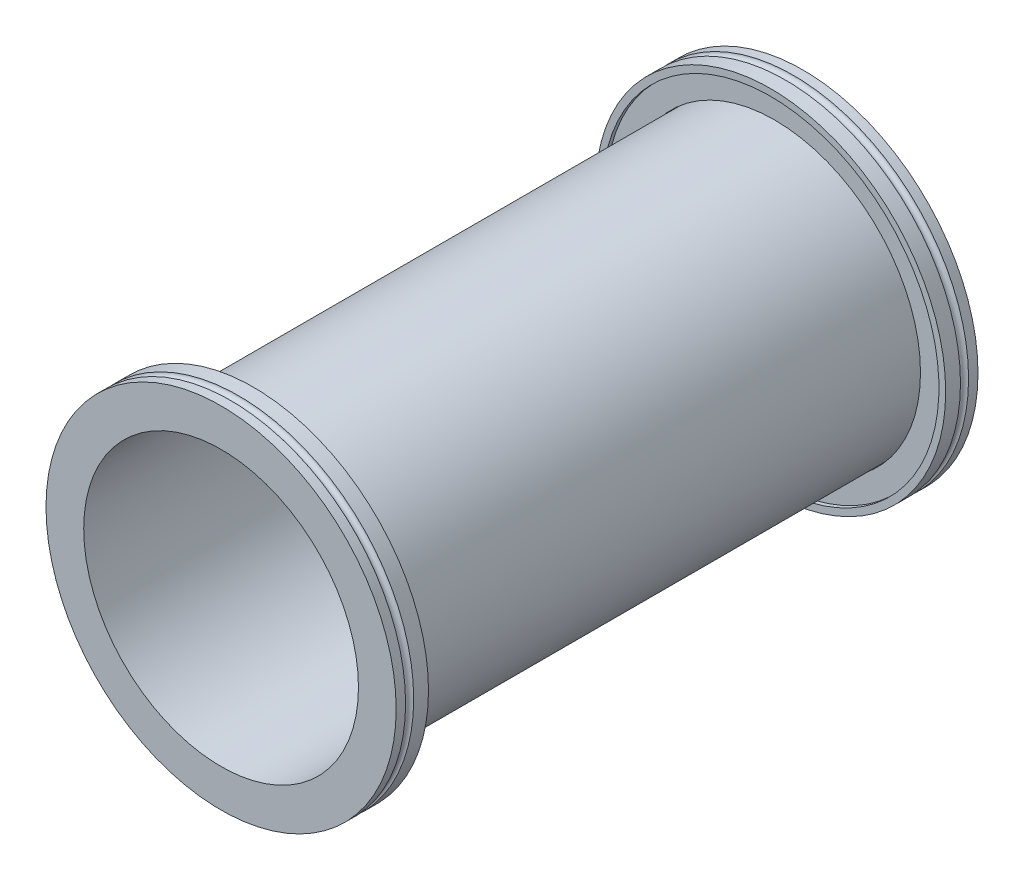
ISO-10303-21;
HEADER;
FILE_DESCRIPTION(('STEP AP214'),'2;1');
FILE_NAME('part.step','',(''),(''),'','','');
FILE_SCHEMA(('AUTOMOTIVE_DESIGN { 1 0 10303 214 1 1 1 1 }'));
ENDSEC;
DATA;
#1=APPLICATION_CONTEXT('core data for automotive mechanical design processes');
#2=APPLICATION_PROTOCOL_DEFINITION('international standard','automotive_design',2000,#1);
#3=PRODUCT_CONTEXT('',#1,'mechanical');
#4=PRODUCT('Part','Part','',(#3));
#5=PRODUCT_RELATED_PRODUCT_CATEGORY('part','',(#4));
#6=PRODUCT_DEFINITION_FORMATION('','',#4);
#7=PRODUCT_DEFINITION_CONTEXT('part definition',#1,'design');
#8=PRODUCT_DEFINITION('design','',#6,#7);
#9=PRODUCT_DEFINITION_SHAPE('','',#8);
#10=(LENGTH_UNIT() NAMED_UNIT(*) SI_UNIT(.MILLI.,.METRE.));
#11=(NAMED_UNIT(*) PLANE_ANGLE_UNIT() SI_UNIT($,.RADIAN.));
#12=(NAMED_UNIT(*) SI_UNIT($,.STERADIAN.) SOLID_ANGLE_UNIT());
#13=UNCERTAINTY_MEASURE_WITH_UNIT(LENGTH_MEASURE(1.E-05),#10,'distance_accuracy_value','');
#14=(GEOMETRIC_REPRESENTATION_CONTEXT(3) GLOBAL_UNCERTAINTY_ASSIGNED_CONTEXT((#13)) GLOBAL_UNIT_ASSIGNED_CONTEXT((#10,
#11,#12)) REPRESENTATION_CONTEXT('',''));
#15=CARTESIAN_POINT('',(0.,0.,0.));
#16=DIRECTION('',(0.,0.,1.));
#17=DIRECTION('',(1.,0.,0.));
#18=AXIS2_PLACEMENT_3D('',#15,#16,#17);
#19=CARTESIAN_POINT('',(0.,0.,0.));
#20=DIRECTION('',(0.,0.,1.));
#21=DIRECTION('',(1.,0.,0.));
#22=AXIS2_PLACEMENT_3D('',#19,#20,#21);
#23=PLANE('',#22);
#24=CARTESIAN_POINT('',(0.,0.,0.));
#25=DIRECTION('',(0.,0.,1.));
#26=DIRECTION('',(1.,0.,0.));
#27=AXIS2_PLACEMENT_3D('',#24,#25,#26);
#28=CIRCLE('',#27,51.);
#29=CARTESIAN_POINT('',(51.,0.,0.));
#30=VERTEX_POINT('',#29);
#31=EDGE_CURVE('E187',#30,#30,#28,.T.);
#32=ORIENTED_EDGE('',*,*,#31,.F.);
#33=EDGE_LOOP('',(#32));
#34=FACE_BOUND('',#33,.T.);
#35=CARTESIAN_POINT('',(0.,0.,0.));
#36=DIRECTION('',(0.,0.,1.));
#37=DIRECTION('',(1.,0.,0.));
#38=AXIS2_PLACEMENT_3D('',#35,#36,#37);
#39=CIRCLE('',#38,65.);
#40=CARTESIAN_POINT('',(65.,0.,0.));
#41=VERTEX_POINT('',#40);
#42=EDGE_CURVE('E159',#41,#41,#39,.T.);
#43=ORIENTED_EDGE('',*,*,#42,.T.);
#44=EDGE_LOOP('',(#43));
#45=FACE_BOUND('',#44,.T.);
#46=ADVANCED_FACE('F17',(#34,#45),#23,.T.);
#47=CARTESIAN_POINT('',(0.,0.,-6.));
#48=DIRECTION('',(0.,0.,-1.));
#49=DIRECTION('',(0.,-1.,0.));
#50=AXIS2_PLACEMENT_3D('',#47,#48,#49);
#51=PLANE('',#50);
#52=CARTESIAN_POINT('',(0.,0.,-6.));
#53=DIRECTION('',(0.,0.,1.));
#54=DIRECTION('',(1.,0.,0.));
#55=AXIS2_PLACEMENT_3D('',#52,#53,#54);
#56=CIRCLE('',#55,54.);
#57=CARTESIAN_POINT('',(54.,0.,-6.));
#58=VERTEX_POINT('',#57);
#59=EDGE_CURVE('E135',#58,#58,#56,.T.);
#60=ORIENTED_EDGE('',*,*,#59,.T.);
#61=EDGE_LOOP('',(#60));
#62=FACE_BOUND('',#61,.T.);
#63=CARTESIAN_POINT('',(0.,0.,-6.));
#64=DIRECTION('',(0.,0.,-1.));
#65=DIRECTION('',(-1.,0.,0.));
#66=AXIS2_PLACEMENT_3D('',#63,#64,#65);
#67=CIRCLE('',#66,54.15);
#68=CARTESIAN_POINT('',(54.15,0.,-6.));
#69=VERTEX_POINT('',#68);
#70=EDGE_CURVE('E141',#69,#69,#67,.T.);
#71=ORIENTED_EDGE('',*,*,#70,.T.);
#72=EDGE_LOOP('',(#71));
#73=FACE_BOUND('',#72,.T.);
#74=ADVANCED_FACE('F136',(#62,#73),#51,.T.);
#75=CARTESIAN_POINT('',(0.,0.,-10.5));
#76=DIRECTION('',(0.,0.,-1.));
#77=DIRECTION('',(0.,-1.,0.));
#78=AXIS2_PLACEMENT_3D('',#75,#76,#77);
#79=PLANE('',#78);
#80=CARTESIAN_POINT('',(0.,0.,-10.5));
#81=DIRECTION('',(0.,0.,1.));
#82=DIRECTION('',(-1.,0.,0.));
#83=AXIS2_PLACEMENT_3D('',#80,#81,#82);
#84=CIRCLE('',#83,54.15);
#85=CARTESIAN_POINT('',(54.15,0.,-10.5));
#86=VERTEX_POINT('',#85);
#87=EDGE_CURVE('E182',#86,#86,#84,.T.);
#88=ORIENTED_EDGE('',*,*,#87,.T.);
#89=EDGE_LOOP('',(#88));
#90=FACE_BOUND('',#89,.T.);
#91=CARTESIAN_POINT('',(0.,0.,-10.5));
#92=DIRECTION('',(0.,0.,-1.));
#93=DIRECTION('',(-1.,0.,0.));
#94=AXIS2_PLACEMENT_3D('',#91,#92,#93);
#95=CIRCLE('',#94,62.5);
#96=CARTESIAN_POINT('',(62.5,0.,-10.5));
#97=VERTEX_POINT('',#96);
#98=EDGE_CURVE('E177',#97,#97,#95,.T.);
#99=ORIENTED_EDGE('',*,*,#98,.T.);
#100=EDGE_LOOP('',(#99));
#101=FACE_BOUND('',#100,.T.);
#102=ADVANCED_FACE('F234',(#90,#101),#79,.T.);
#103=CARTESIAN_POINT('',(0.,0.,-12.));
#104=DIRECTION('',(0.,0.,1.));
#105=DIRECTION('',(1.,0.,0.));
#106=AXIS2_PLACEMENT_3D('',#103,#104,#105);
#107=PLANE('',#106);
#108=CARTESIAN_POINT('',(0.,0.,-12.));
#109=DIRECTION('',(0.,0.,-1.));
#110=DIRECTION('',(-1.,0.,0.));
#111=AXIS2_PLACEMENT_3D('',#108,#109,#110);
#112=CIRCLE('',#111,62.5);
#113=CARTESIAN_POINT('',(62.5,0.,-12.));
#114=VERTEX_POINT('',#113);
#115=EDGE_CURVE('E81',#114,#114,#112,.T.);
#116=ORIENTED_EDGE('',*,*,#115,.F.);
#117=EDGE_LOOP('',(#116));
#118=FACE_BOUND('',#117,.T.);
#119=CARTESIAN_POINT('',(0.,0.,-12.));
#120=DIRECTION('',(0.,0.,1.));
#121=DIRECTION('',(1.,0.,0.));
#122=AXIS2_PLACEMENT_3D('',#119,#120,#121);
#123=CIRCLE('',#122,65.);
#124=CARTESIAN_POINT('',(65.,0.,-12.));
#125=VERTEX_POINT('',#124);
#126=EDGE_CURVE('E155',#125,#125,#123,.T.);
#127=ORIENTED_EDGE('',*,*,#126,.F.);
#128=EDGE_LOOP('',(#127));
#129=FACE_BOUND('',#128,.T.);
#130=ADVANCED_FACE('F244',(#118,#129),#107,.F.);
#131=CARTESIAN_POINT('',(0.,0.,-216.));
#132=DIRECTION('',(0.,0.,-1.));
#133=DIRECTION('',(-1.,0.,0.));
#134=AXIS2_PLACEMENT_3D('',#131,#132,#133);
#135=PLANE('',#134);
#136=CARTESIAN_POINT('',(0.,0.,-216.));
#137=DIRECTION('',(0.,0.,-1.));
#138=DIRECTION('',(-1.,0.,0.));
#139=AXIS2_PLACEMENT_3D('',#136,#137,#138);
#140=CIRCLE('',#139,51.);
#141=CARTESIAN_POINT('',(51.,0.,-216.));
#142=VERTEX_POINT('',#141);
#143=EDGE_CURVE('E97',#142,#142,#140,.T.);
#144=ORIENTED_EDGE('',*,*,#143,.F.);
#145=EDGE_LOOP('',(#144));
#146=FACE_BOUND('',#145,.T.);
#147=CARTESIAN_POINT('',(0.,0.,-216.));
#148=DIRECTION('',(0.,0.,-1.));
#149=DIRECTION('',(-1.,0.,0.));
#150=AXIS2_PLACEMENT_3D('',#147,#148,#149);
#151=CIRCLE('',#150,65.);
#152=CARTESIAN_POINT('',(-65.,0.,-216.));
#153=VERTEX_POINT('',#152);
#154=EDGE_CURVE('E188',#153,#153,#151,.T.);
#155=ORIENTED_EDGE('',*,*,#154,.T.);
#156=EDGE_LOOP('',(#155));
#157=FACE_BOUND('',#156,.T.);
#158=ADVANCED_FACE('F284',(#146,#157),#135,.T.);
#159=CARTESIAN_POINT('',(0.,0.,-210.));
#160=DIRECTION('',(0.,0.,1.));
#161=DIRECTION('',(1.,0.,0.));
#162=AXIS2_PLACEMENT_3D('',#159,#160,#161);
#163=PLANE('',#162);
#164=CARTESIAN_POINT('',(0.,0.,-210.));
#165=DIRECTION('',(0.,0.,-1.));
#166=DIRECTION('',(1.,0.,0.));
#167=AXIS2_PLACEMENT_3D('',#164,#165,#166);
#168=CIRCLE('',#167,54.);
#169=CARTESIAN_POINT('',(54.,0.,-210.));
#170=VERTEX_POINT('',#169);
#171=EDGE_CURVE('E150',#170,#170,#168,.T.);
#172=ORIENTED_EDGE('',*,*,#171,.T.);
#173=EDGE_LOOP('',(#172));
#174=FACE_BOUND('',#173,.T.);
#175=CARTESIAN_POINT('',(0.,0.,-210.));
#176=DIRECTION('',(0.,0.,1.));
#177=DIRECTION('',(1.,0.,0.));
#178=AXIS2_PLACEMENT_3D('',#175,#176,#177);
#179=CIRCLE('',#178,54.15);
#180=CARTESIAN_POINT('',(-54.15,0.,-210.));
#181=VERTEX_POINT('',#180);
#182=EDGE_CURVE('E166',#181,#181,#179,.T.);
#183=ORIENTED_EDGE('',*,*,#182,.T.);
#184=EDGE_LOOP('',(#183));
#185=FACE_BOUND('',#184,.T.);
#186=ADVANCED_FACE('F280',(#174,#185),#163,.T.);
#187=CARTESIAN_POINT('',(0.,0.,-205.5));
#188=DIRECTION('',(0.,0.,1.));
#189=DIRECTION('',(1.,0.,0.));
#190=AXIS2_PLACEMENT_3D('',#187,#188,#189);
#191=PLANE('',#190);
#192=CARTESIAN_POINT('',(0.,0.,-205.5));
#193=DIRECTION('',(0.,0.,-1.));
#194=DIRECTION('',(1.,0.,0.));
#195=AXIS2_PLACEMENT_3D('',#192,#193,#194);
#196=CIRCLE('',#195,54.15);
#197=CARTESIAN_POINT('',(-54.15,0.,-205.5));
#198=VERTEX_POINT('',#197);
#199=EDGE_CURVE('E214',#198,#198,#196,.T.);
#200=ORIENTED_EDGE('',*,*,#199,.T.);
#201=EDGE_LOOP('',(#200));
#202=FACE_BOUND('',#201,.T.);
#203=CARTESIAN_POINT('',(0.,0.,-205.5));
#204=DIRECTION('',(0.,0.,1.));
#205=DIRECTION('',(1.,0.,0.));
#206=AXIS2_PLACEMENT_3D('',#203,#204,#205);
#207=CIRCLE('',#206,62.5);
#208=CARTESIAN_POINT('',(-62.5,0.,-205.5));
#209=VERTEX_POINT('',#208);
#210=EDGE_CURVE('E217',#209,#209,#207,.T.);
#211=ORIENTED_EDGE('',*,*,#210,.T.);
#212=EDGE_LOOP('',(#211));
#213=FACE_BOUND('',#212,.T.);
#214=ADVANCED_FACE('F277',(#202,#213),#191,.T.);
#215=CARTESIAN_POINT('',(0.,0.,-204.));
#216=DIRECTION('',(0.,0.,-1.));
#217=DIRECTION('',(-1.,0.,0.));
#218=AXIS2_PLACEMENT_3D('',#215,#216,#217);
#219=PLANE('',#218);
#220=CARTESIAN_POINT('',(0.,0.,-204.));
#221=DIRECTION('',(0.,0.,1.));
#222=DIRECTION('',(1.,0.,0.));
#223=AXIS2_PLACEMENT_3D('',#220,#221,#222);
#224=CIRCLE('',#223,62.5);
#225=CARTESIAN_POINT('',(-62.5,0.,-204.));
#226=VERTEX_POINT('',#225);
#227=EDGE_CURVE('E11',#226,#226,#224,.T.);
#228=ORIENTED_EDGE('',*,*,#227,.F.);
#229=EDGE_LOOP('',(#228));
#230=FACE_BOUND('',#229,.T.);
#231=CARTESIAN_POINT('',(0.,0.,-204.));
#232=DIRECTION('',(0.,0.,-1.));
#233=DIRECTION('',(-1.,0.,0.));
#234=AXIS2_PLACEMENT_3D('',#231,#232,#233);
#235=CIRCLE('',#234,65.);
#236=CARTESIAN_POINT('',(-65.,0.,-204.));
#237=VERTEX_POINT('',#236);
#238=EDGE_CURVE('E167',#237,#237,#235,.T.);
#239=ORIENTED_EDGE('',*,*,#238,.F.);
#240=EDGE_LOOP('',(#239));
#241=FACE_BOUND('',#240,.T.);
#242=ADVANCED_FACE('F268',(#230,#241),#219,.F.);
#243=CARTESIAN_POINT('',(0.,0.,-205.5));
#244=DIRECTION('',(0.,0.,1.));
#245=DIRECTION('',(1.,0.,0.));
#246=AXIS2_PLACEMENT_3D('',#243,#244,#245);
#247=CYLINDRICAL_SURFACE('',#246,62.5);
#248=ORIENTED_EDGE('',*,*,#210,.F.);
#249=DIRECTION('',(0.,0.,1.));
#250=VECTOR('',#249,1.);
#251=CARTESIAN_POINT('',(-62.5,0.,-205.5));
#252=LINE('',#251,#250);
#253=EDGE_CURVE('E28',#209,#226,#252,.T.);
#254=ORIENTED_EDGE('',*,*,#253,.T.);
#255=ORIENTED_EDGE('',*,*,#227,.T.);
#256=ORIENTED_EDGE('',*,*,#253,.F.);
#257=EDGE_LOOP('',(#248,#254,#255,#256));
#258=FACE_BOUND('',#257,.T.);
#259=ADVANCED_FACE('F255',(#258),#247,.F.);
#260=CARTESIAN_POINT('',(0.,0.,-210.));
#261=DIRECTION('',(0.,0.,1.));
#262=DIRECTION('',(1.,0.,0.));
#263=AXIS2_PLACEMENT_3D('',#260,#261,#262);
#264=CYLINDRICAL_SURFACE('',#263,54.15);
#265=ORIENTED_EDGE('',*,*,#182,.F.);
#266=DIRECTION('',(0.,0.,1.));
#267=VECTOR('',#266,1.);
#268=CARTESIAN_POINT('',(-54.15,0.,-210.));
#269=LINE('',#268,#267);
#270=EDGE_CURVE('E210',#181,#198,#269,.T.);
#271=ORIENTED_EDGE('',*,*,#270,.T.);
#272=ORIENTED_EDGE('',*,*,#199,.F.);
#273=ORIENTED_EDGE('',*,*,#270,.F.);
#274=EDGE_LOOP('',(#265,#271,#272,#273));
#275=FACE_BOUND('',#274,.T.);
#276=ADVANCED_FACE('F251',(#275),#264,.F.);
#277=CARTESIAN_POINT('',(0.,0.,-216.));
#278=DIRECTION('',(0.,0.,1.));
#279=DIRECTION('',(1.,0.,0.));
#280=AXIS2_PLACEMENT_3D('',#277,#278,#279);
#281=CYLINDRICAL_SURFACE('',#280,65.);
#282=ORIENTED_EDGE('',*,*,#238,.T.);
#283=DIRECTION('',(0.,0.,-1.));
#284=VECTOR('',#283,1.);
#285=CARTESIAN_POINT('',(-65.,0.,-216.));
#286=LINE('',#285,#284);
#287=CARTESIAN_POINT('',(-65.,0.,-209.5));
#288=VERTEX_POINT('',#287);
#289=EDGE_CURVE('E163',#237,#288,#286,.T.);
#290=ORIENTED_EDGE('',*,*,#289,.T.);
#291=CARTESIAN_POINT('',(0.,0.,-209.5));
#292=DIRECTION('',(0.,0.,-1.));
#293=DIRECTION('',(-1.,0.,0.));
#294=AXIS2_PLACEMENT_3D('',#291,#292,#293);
#295=CIRCLE('',#294,65.);
#296=EDGE_CURVE('E168',#288,#288,#295,.T.);
#297=ORIENTED_EDGE('',*,*,#296,.F.);
#298=ORIENTED_EDGE('',*,*,#289,.F.);
#299=EDGE_LOOP('',(#282,#290,#297,#298));
#300=FACE_BOUND('',#299,.T.);
#301=ADVANCED_FACE('F254',(#300),#281,.T.);
#302=CARTESIAN_POINT('',(0.,0.,-216.));
#303=DIRECTION('',(0.,0.,1.));
#304=DIRECTION('',(1.,0.,0.));
#305=AXIS2_PLACEMENT_3D('',#302,#303,#304);
#306=CYLINDRICAL_SURFACE('',#305,65.);
#307=CARTESIAN_POINT('',(0.,0.,-212.5));
#308=DIRECTION('',(0.,0.,1.));
#309=DIRECTION('',(1.,0.,0.));
#310=AXIS2_PLACEMENT_3D('',#307,#308,#309);
#311=CIRCLE('',#310,65.);
#312=CARTESIAN_POINT('',(-65.,0.,-212.5));
#313=VERTEX_POINT('',#312);
#314=EDGE_CURVE('E225',#313,#313,#311,.T.);
#315=ORIENTED_EDGE('',*,*,#314,.F.);
#316=DIRECTION('',(0.,0.,-1.));
#317=VECTOR('',#316,1.);
#318=CARTESIAN_POINT('',(-65.,0.,-216.));
#319=LINE('',#318,#317);
#320=EDGE_CURVE('E190',#313,#153,#319,.T.);
#321=ORIENTED_EDGE('',*,*,#320,.T.);
#322=ORIENTED_EDGE('',*,*,#154,.F.);
#323=ORIENTED_EDGE('',*,*,#320,.F.);
#324=EDGE_LOOP('',(#315,#321,#322,#323));
#325=FACE_BOUND('',#324,.T.);
#326=ADVANCED_FACE('F261',(#325),#306,.T.);
#327=CARTESIAN_POINT('',(0.,0.,-204.));
#328=DIRECTION('',(0.,0.,-1.));
#329=DIRECTION('',(-1.,0.,0.));
#330=AXIS2_PLACEMENT_3D('',#327,#328,#329);
#331=CYLINDRICAL_SURFACE('',#330,51.);
#332=ORIENTED_EDGE('',*,*,#31,.T.);
#333=DIRECTION('',(0.,0.,-1.));
#334=VECTOR('',#333,1.);
#335=CARTESIAN_POINT('',(51.,0.,-204.));
#336=LINE('',#335,#334);
#337=EDGE_CURVE('E90',#30,#142,#336,.T.);
#338=ORIENTED_EDGE('',*,*,#337,.T.);
#339=ORIENTED_EDGE('',*,*,#143,.T.);
#340=ORIENTED_EDGE('',*,*,#337,.F.);
#341=EDGE_LOOP('',(#332,#338,#339,#340));
#342=FACE_BOUND('',#341,.T.);
#343=ADVANCED_FACE('F257',(#342),#331,.F.);
#344=CARTESIAN_POINT('',(0.,0.,-10.5));
#345=DIRECTION('',(0.,0.,-1.));
#346=DIRECTION('',(-1.,0.,0.));
#347=AXIS2_PLACEMENT_3D('',#344,#345,#346);
#348=CYLINDRICAL_SURFACE('',#347,62.5);
#349=ORIENTED_EDGE('',*,*,#98,.F.);
#350=DIRECTION('',(0.,0.,-1.));
#351=VECTOR('',#350,1.);
#352=CARTESIAN_POINT('',(62.5,0.,-10.5));
#353=LINE('',#352,#351);
#354=EDGE_CURVE('E181',#97,#114,#353,.T.);
#355=ORIENTED_EDGE('',*,*,#354,.T.);
#356=ORIENTED_EDGE('',*,*,#115,.T.);
#357=ORIENTED_EDGE('',*,*,#354,.F.);
#358=EDGE_LOOP('',(#349,#355,#356,#357));
#359=FACE_BOUND('',#358,.T.);
#360=ADVANCED_FACE('F260',(#359),#348,.F.);
#361=CARTESIAN_POINT('',(0.,0.,-6.));
#362=DIRECTION('',(0.,0.,-1.));
#363=DIRECTION('',(-1.,0.,0.));
#364=AXIS2_PLACEMENT_3D('',#361,#362,#363);
#365=CYLINDRICAL_SURFACE('',#364,54.15);
#366=ORIENTED_EDGE('',*,*,#70,.F.);
#367=DIRECTION('',(0.,0.,-1.));
#368=VECTOR('',#367,1.);
#369=CARTESIAN_POINT('',(54.15,0.,-6.));
#370=LINE('',#369,#368);
#371=EDGE_CURVE('E129',#69,#86,#370,.T.);
#372=ORIENTED_EDGE('',*,*,#371,.T.);
#373=ORIENTED_EDGE('',*,*,#87,.F.);
#374=ORIENTED_EDGE('',*,*,#371,.F.);
#375=EDGE_LOOP('',(#366,#372,#373,#374));
#376=FACE_BOUND('',#375,.T.);
#377=ADVANCED_FACE('F236',(#376),#365,.F.);
#378=CARTESIAN_POINT('',(0.,0.,-6.));
#379=DIRECTION('',(0.,0.,-1.));
#380=DIRECTION('',(-1.,0.,0.));
#381=AXIS2_PLACEMENT_3D('',#378,#379,#380);
#382=CYLINDRICAL_SURFACE('',#381,54.);
#383=ORIENTED_EDGE('',*,*,#171,.F.);
#384=DIRECTION('',(0.,0.,1.));
#385=VECTOR('',#384,1.);
#386=CARTESIAN_POINT('',(54.,0.,-6.));
#387=LINE('',#386,#385);
#388=EDGE_CURVE('E142',#170,#58,#387,.T.);
#389=ORIENTED_EDGE('',*,*,#388,.T.);
#390=ORIENTED_EDGE('',*,*,#59,.F.);
#391=ORIENTED_EDGE('',*,*,#388,.F.);
#392=EDGE_LOOP('',(#383,#389,#390,#391));
#393=FACE_BOUND('',#392,.T.);
#394=ADVANCED_FACE('F262',(#393),#382,.T.);
#395=CARTESIAN_POINT('',(0.,0.,0.));
#396=DIRECTION('',(0.,0.,-1.));
#397=DIRECTION('',(-1.,0.,0.));
#398=AXIS2_PLACEMENT_3D('',#395,#396,#397);
#399=CYLINDRICAL_SURFACE('',#398,65.);
#400=ORIENTED_EDGE('',*,*,#126,.T.);
#401=DIRECTION('',(0.,0.,1.));
#402=VECTOR('',#401,1.);
#403=CARTESIAN_POINT('',(65.,0.,0.));
#404=LINE('',#403,#402);
#405=CARTESIAN_POINT('',(65.,0.,-6.5));
#406=VERTEX_POINT('',#405);
#407=EDGE_CURVE('E158',#125,#406,#404,.T.);
#408=ORIENTED_EDGE('',*,*,#407,.T.);
#409=CARTESIAN_POINT('',(0.,0.,-6.5));
#410=DIRECTION('',(0.,0.,1.));
#411=DIRECTION('',(1.,0.,0.));
#412=AXIS2_PLACEMENT_3D('',#409,#410,#411);
#413=CIRCLE('',#412,65.);
#414=EDGE_CURVE('E313',#406,#406,#413,.T.);
#415=ORIENTED_EDGE('',*,*,#414,.F.);
#416=ORIENTED_EDGE('',*,*,#407,.F.);
#417=EDGE_LOOP('',(#400,#408,#415,#416));
#418=FACE_BOUND('',#417,.T.);
#419=ADVANCED_FACE('F265',(#418),#399,.T.);
#420=CARTESIAN_POINT('',(0.,0.,0.));
#421=DIRECTION('',(0.,0.,-1.));
#422=DIRECTION('',(-1.,0.,0.));
#423=AXIS2_PLACEMENT_3D('',#420,#421,#422);
#424=CYLINDRICAL_SURFACE('',#423,65.);
#425=CARTESIAN_POINT('',(0.,0.,-3.5));
#426=DIRECTION('',(0.,0.,-1.));
#427=DIRECTION('',(-1.,0.,0.));
#428=AXIS2_PLACEMENT_3D('',#425,#426,#427);
#429=CIRCLE('',#428,65.);
#430=CARTESIAN_POINT('',(65.,0.,-3.5));
#431=VERTEX_POINT('',#430);
#432=EDGE_CURVE('E173',#431,#431,#429,.T.);
#433=ORIENTED_EDGE('',*,*,#432,.F.);
#434=DIRECTION('',(0.,0.,1.));
#435=VECTOR('',#434,1.);
#436=CARTESIAN_POINT('',(65.,0.,0.));
#437=LINE('',#436,#435);
#438=EDGE_CURVE('E185',#431,#41,#437,.T.);
#439=ORIENTED_EDGE('',*,*,#438,.T.);
#440=ORIENTED_EDGE('',*,*,#42,.F.);
#441=ORIENTED_EDGE('',*,*,#438,.F.);
#442=EDGE_LOOP('',(#433,#439,#440,#441));
#443=FACE_BOUND('',#442,.T.);
#444=ADVANCED_FACE('F19',(#443),#424,.T.);
#445=CARTESIAN_POINT('',(0.,0.,-211.));
#446=DIRECTION('',(0.,0.,1.));
#447=DIRECTION('',(1.,0.,0.));
#448=AXIS2_PLACEMENT_3D('',#445,#446,#447);
#449=TOROIDAL_SURFACE('',#448,65.,1.5);
#450=ORIENTED_EDGE('',*,*,#296,.T.);
#451=CARTESIAN_POINT('',(-65.,0.,-211.));
#452=DIRECTION('',(0.,1.,0.));
#453=DIRECTION('',(-1.,0.,0.));
#454=AXIS2_PLACEMENT_3D('',#451,#452,#453);
#455=CIRCLE('',#454,1.5);
#456=EDGE_CURVE('E172',#288,#313,#455,.T.);
#457=ORIENTED_EDGE('',*,*,#456,.T.);
#458=ORIENTED_EDGE('',*,*,#314,.T.);
#459=ORIENTED_EDGE('',*,*,#456,.F.);
#460=EDGE_LOOP('',(#450,#457,#458,#459));
#461=FACE_BOUND('',#460,.T.);
#462=ADVANCED_FACE('F249',(#461),#449,.F.);
#463=CARTESIAN_POINT('',(0.,0.,-5.));
#464=DIRECTION('',(0.,0.,-1.));
#465=DIRECTION('',(-1.,0.,0.));
#466=AXIS2_PLACEMENT_3D('',#463,#464,#465);
#467=TOROIDAL_SURFACE('',#466,65.,1.5);
#468=ORIENTED_EDGE('',*,*,#414,.T.);
#469=CARTESIAN_POINT('',(65.,0.,-5.));
#470=DIRECTION('',(0.,1.,0.));
#471=DIRECTION('',(1.,0.,0.));
#472=AXIS2_PLACEMENT_3D('',#469,#470,#471);
#473=CIRCLE('',#472,1.5);
#474=EDGE_CURVE('E21',#406,#431,#473,.T.);
#475=ORIENTED_EDGE('',*,*,#474,.T.);
#476=ORIENTED_EDGE('',*,*,#432,.T.);
#477=ORIENTED_EDGE('',*,*,#474,.F.);
#478=EDGE_LOOP('',(#468,#475,#476,#477));
#479=FACE_BOUND('',#478,.T.);
#480=ADVANCED_FACE('F271',(#479),#467,.F.);
#481=CLOSED_SHELL('',(#46,#74,#102,#130,#158,#186,#214,#242,#259,#276,#301,#326,#343,#360,#377,
#394,#419,#444,#462,#480));
#482=MANIFOLD_SOLID_BREP('B1',#481);
#483=ADVANCED_BREP_SHAPE_REPRESENTATION('',(#18,#482),#14);
#484=SHAPE_DEFINITION_REPRESENTATION(#9,#483);
ENDSEC;
END-ISO-10303-21;
